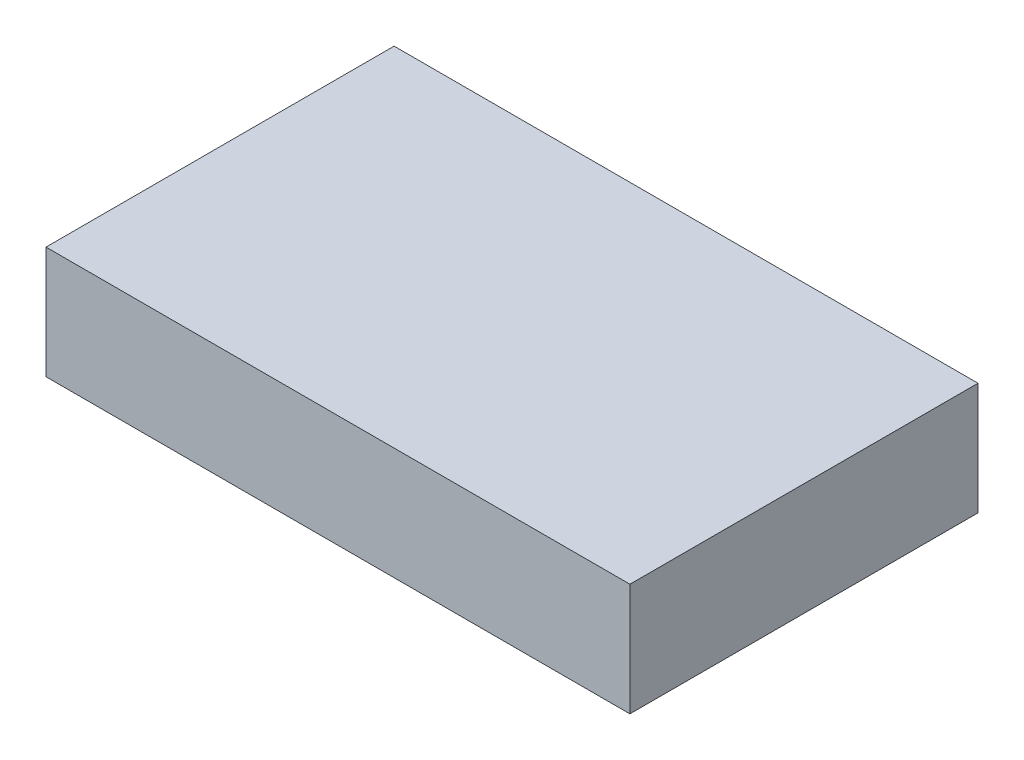
ISO-10303-21;
HEADER;
FILE_DESCRIPTION(('STEP AP214'),'2;1');
FILE_NAME('part.step','',(''),(''),'','','');
FILE_SCHEMA(('AUTOMOTIVE_DESIGN { 1 0 10303 214 1 1 1 1 }'));
ENDSEC;
DATA;
#1=APPLICATION_CONTEXT('core data for automotive mechanical design processes');
#2=APPLICATION_PROTOCOL_DEFINITION('international standard','automotive_design',2000,#1);
#3=PRODUCT_CONTEXT('',#1,'mechanical');
#4=PRODUCT('Part','Part','',(#3));
#5=PRODUCT_RELATED_PRODUCT_CATEGORY('part','',(#4));
#6=PRODUCT_DEFINITION_FORMATION('','',#4);
#7=PRODUCT_DEFINITION_CONTEXT('part definition',#1,'design');
#8=PRODUCT_DEFINITION('design','',#6,#7);
#9=PRODUCT_DEFINITION_SHAPE('','',#8);
#10=(LENGTH_UNIT() NAMED_UNIT(*) SI_UNIT(.MILLI.,.METRE.));
#11=(NAMED_UNIT(*) PLANE_ANGLE_UNIT() SI_UNIT($,.RADIAN.));
#12=(NAMED_UNIT(*) SI_UNIT($,.STERADIAN.) SOLID_ANGLE_UNIT());
#13=UNCERTAINTY_MEASURE_WITH_UNIT(LENGTH_MEASURE(1.E-05),#10,'distance_accuracy_value','');
#14=(GEOMETRIC_REPRESENTATION_CONTEXT(3) GLOBAL_UNCERTAINTY_ASSIGNED_CONTEXT((#13)) GLOBAL_UNIT_ASSIGNED_CONTEXT((#10,
#11,#12)) REPRESENTATION_CONTEXT('',''));
#15=CARTESIAN_POINT('',(0.,0.,0.));
#16=DIRECTION('',(0.,0.,1.));
#17=DIRECTION('',(1.,0.,0.));
#18=AXIS2_PLACEMENT_3D('',#15,#16,#17);
#19=CARTESIAN_POINT('',(82.55,31.75,49.2125));
#20=DIRECTION('',(-1.,0.,0.));
#21=DIRECTION('',(0.,0.,1.));
#22=AXIS2_PLACEMENT_3D('',#19,#20,#21);
#23=PLANE('',#22);
#24=DIRECTION('',(0.,0.,-1.));
#25=VECTOR('',#24,1.);
#26=CARTESIAN_POINT('',(82.55,0.,49.2125));
#27=LINE('',#26,#25);
#28=CARTESIAN_POINT('',(82.55,0.,49.2125));
#29=VERTEX_POINT('',#28);
#30=CARTESIAN_POINT('',(82.55,0.,-49.2125));
#31=VERTEX_POINT('',#30);
#32=EDGE_CURVE('E100',#29,#31,#27,.T.);
#33=ORIENTED_EDGE('',*,*,#32,.T.);
#34=DIRECTION('',(0.,-1.,0.));
#35=VECTOR('',#34,1.);
#36=CARTESIAN_POINT('',(82.55,31.75,-49.2125));
#37=LINE('',#36,#35);
#38=CARTESIAN_POINT('',(82.55,31.75,-49.2125));
#39=VERTEX_POINT('',#38);
#40=EDGE_CURVE('E11',#39,#31,#37,.T.);
#41=ORIENTED_EDGE('',*,*,#40,.F.);
#42=DIRECTION('',(0.,0.,-1.));
#43=VECTOR('',#42,1.);
#44=CARTESIAN_POINT('',(82.55,31.75,49.2125));
#45=LINE('',#44,#43);
#46=CARTESIAN_POINT('',(82.55,31.75,49.2125));
#47=VERTEX_POINT('',#46);
#48=EDGE_CURVE('E88',#47,#39,#45,.T.);
#49=ORIENTED_EDGE('',*,*,#48,.F.);
#50=DIRECTION('',(0.,-1.,0.));
#51=VECTOR('',#50,1.);
#52=CARTESIAN_POINT('',(82.55,31.75,49.2125));
#53=LINE('',#52,#51);
#54=EDGE_CURVE('E96',#47,#29,#53,.T.);
#55=ORIENTED_EDGE('',*,*,#54,.T.);
#56=EDGE_LOOP('',(#33,#41,#49,#55));
#57=FACE_BOUND('',#56,.T.);
#58=ADVANCED_FACE('F37',(#57),#23,.F.);
#59=CARTESIAN_POINT('',(-82.55,31.75,-49.2125));
#60=DIRECTION('',(0.,0.,1.));
#61=DIRECTION('',(1.,0.,0.));
#62=AXIS2_PLACEMENT_3D('',#59,#60,#61);
#63=PLANE('',#62);
#64=DIRECTION('',(-1.,0.,0.));
#65=VECTOR('',#64,1.);
#66=CARTESIAN_POINT('',(-82.55,0.,-49.2125));
#67=LINE('',#66,#65);
#68=CARTESIAN_POINT('',(-82.55,0.,-49.2125));
#69=VERTEX_POINT('',#68);
#70=EDGE_CURVE('E92',#31,#69,#67,.T.);
#71=ORIENTED_EDGE('',*,*,#70,.T.);
#72=DIRECTION('',(0.,-1.,0.));
#73=VECTOR('',#72,1.);
#74=CARTESIAN_POINT('',(-82.55,31.75,-49.2125));
#75=LINE('',#74,#73);
#76=CARTESIAN_POINT('',(-82.55,31.75,-49.2125));
#77=VERTEX_POINT('',#76);
#78=EDGE_CURVE('E45',#77,#69,#75,.T.);
#79=ORIENTED_EDGE('',*,*,#78,.F.);
#80=DIRECTION('',(-1.,0.,0.));
#81=VECTOR('',#80,1.);
#82=CARTESIAN_POINT('',(-82.55,31.75,-49.2125));
#83=LINE('',#82,#81);
#84=EDGE_CURVE('E83',#39,#77,#83,.T.);
#85=ORIENTED_EDGE('',*,*,#84,.F.);
#86=ORIENTED_EDGE('',*,*,#40,.T.);
#87=EDGE_LOOP('',(#71,#79,#85,#86));
#88=FACE_BOUND('',#87,.T.);
#89=ADVANCED_FACE('F91',(#88),#63,.F.);
#90=CARTESIAN_POINT('',(-82.55,31.75,49.2125));
#91=DIRECTION('',(1.,0.,0.));
#92=DIRECTION('',(0.,0.,-1.));
#93=AXIS2_PLACEMENT_3D('',#90,#91,#92);
#94=PLANE('',#93);
#95=DIRECTION('',(0.,0.,1.));
#96=VECTOR('',#95,1.);
#97=CARTESIAN_POINT('',(-82.55,0.,49.2125));
#98=LINE('',#97,#96);
#99=CARTESIAN_POINT('',(-82.55,0.,49.2125));
#100=VERTEX_POINT('',#99);
#101=EDGE_CURVE('E70',#69,#100,#98,.T.);
#102=ORIENTED_EDGE('',*,*,#101,.T.);
#103=DIRECTION('',(0.,-1.,0.));
#104=VECTOR('',#103,1.);
#105=CARTESIAN_POINT('',(-82.55,31.75,49.2125));
#106=LINE('',#105,#104);
#107=CARTESIAN_POINT('',(-82.55,31.75,49.2125));
#108=VERTEX_POINT('',#107);
#109=EDGE_CURVE('E93',#108,#100,#106,.T.);
#110=ORIENTED_EDGE('',*,*,#109,.F.);
#111=DIRECTION('',(0.,0.,1.));
#112=VECTOR('',#111,1.);
#113=CARTESIAN_POINT('',(-82.55,31.75,49.2125));
#114=LINE('',#113,#112);
#115=EDGE_CURVE('E86',#77,#108,#114,.T.);
#116=ORIENTED_EDGE('',*,*,#115,.F.);
#117=ORIENTED_EDGE('',*,*,#78,.T.);
#118=EDGE_LOOP('',(#102,#110,#116,#117));
#119=FACE_BOUND('',#118,.T.);
#120=ADVANCED_FACE('F94',(#119),#94,.F.);
#121=CARTESIAN_POINT('',(-82.55,31.75,49.2125));
#122=DIRECTION('',(0.,0.,-1.));
#123=DIRECTION('',(-1.,0.,0.));
#124=AXIS2_PLACEMENT_3D('',#121,#122,#123);
#125=PLANE('',#124);
#126=DIRECTION('',(1.,0.,0.));
#127=VECTOR('',#126,1.);
#128=CARTESIAN_POINT('',(-82.55,0.,49.2125));
#129=LINE('',#128,#127);
#130=EDGE_CURVE('E76',#100,#29,#129,.T.);
#131=ORIENTED_EDGE('',*,*,#130,.T.);
#132=ORIENTED_EDGE('',*,*,#54,.F.);
#133=DIRECTION('',(1.,0.,0.));
#134=VECTOR('',#133,1.);
#135=CARTESIAN_POINT('',(-82.55,31.75,49.2125));
#136=LINE('',#135,#134);
#137=EDGE_CURVE('E53',#108,#47,#136,.T.);
#138=ORIENTED_EDGE('',*,*,#137,.F.);
#139=ORIENTED_EDGE('',*,*,#109,.T.);
#140=EDGE_LOOP('',(#131,#132,#138,#139));
#141=FACE_BOUND('',#140,.T.);
#142=ADVANCED_FACE('F107',(#141),#125,.F.);
#143=CARTESIAN_POINT('',(0.,31.75,0.));
#144=DIRECTION('',(0.,-1.,0.));
#145=DIRECTION('',(0.,0.,-1.));
#146=AXIS2_PLACEMENT_3D('',#143,#144,#145);
#147=PLANE('',#146);
#148=ORIENTED_EDGE('',*,*,#48,.T.);
#149=ORIENTED_EDGE('',*,*,#84,.T.);
#150=ORIENTED_EDGE('',*,*,#115,.T.);
#151=ORIENTED_EDGE('',*,*,#137,.T.);
#152=EDGE_LOOP('',(#148,#149,#150,#151));
#153=FACE_BOUND('',#152,.T.);
#154=ADVANCED_FACE('F84',(#153),#147,.F.);
#155=CARTESIAN_POINT('',(0.,0.,0.));
#156=DIRECTION('',(0.,-1.,0.));
#157=DIRECTION('',(0.,0.,-1.));
#158=AXIS2_PLACEMENT_3D('',#155,#156,#157);
#159=PLANE('',#158);
#160=ORIENTED_EDGE('',*,*,#32,.F.);
#161=ORIENTED_EDGE('',*,*,#130,.F.);
#162=ORIENTED_EDGE('',*,*,#101,.F.);
#163=ORIENTED_EDGE('',*,*,#70,.F.);
#164=EDGE_LOOP('',(#160,#161,#162,#163));
#165=FACE_BOUND('',#164,.T.);
#166=ADVANCED_FACE('F110',(#165),#159,.T.);
#167=CLOSED_SHELL('',(#58,#89,#120,#142,#154,#166));
#168=MANIFOLD_SOLID_BREP('B2',#167);
#169=ADVANCED_BREP_SHAPE_REPRESENTATION('',(#18,#168),#14);
#170=SHAPE_DEFINITION_REPRESENTATION(#9,#169);
ENDSEC;
END-ISO-10303-21;
